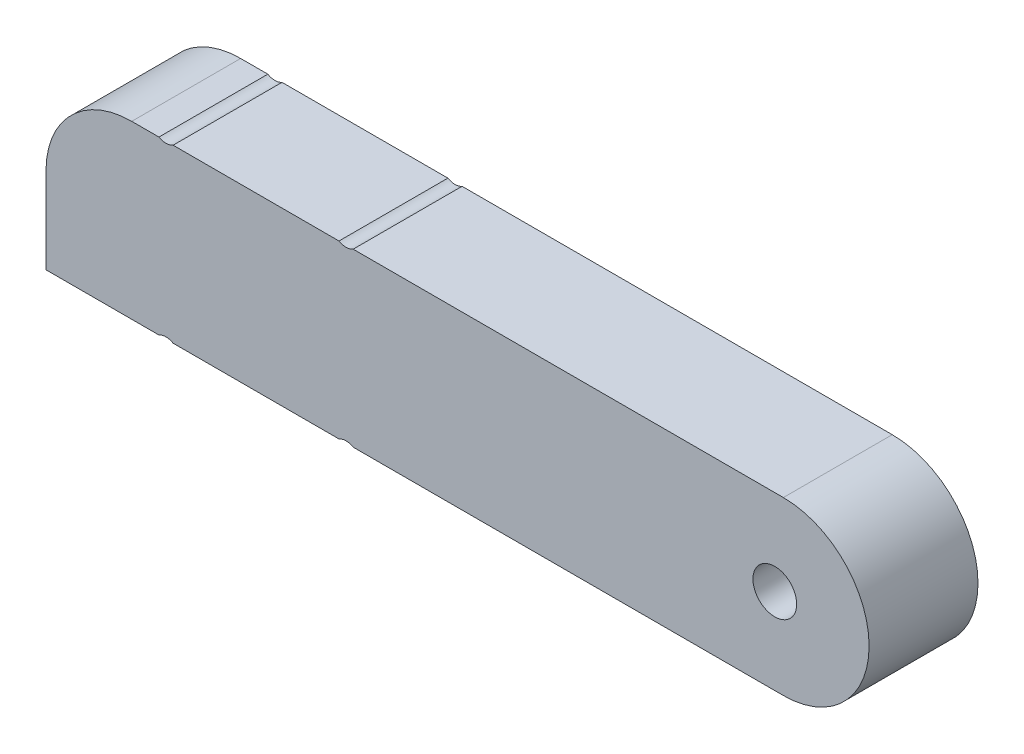
ISO-10303-21;
HEADER;
FILE_DESCRIPTION(('STEP AP214'),'2;1');
FILE_NAME('part.step','',(''),(''),'','','');
FILE_SCHEMA(('AUTOMOTIVE_DESIGN { 1 0 10303 214 1 1 1 1 }'));
ENDSEC;
DATA;
#1=APPLICATION_CONTEXT('core data for automotive mechanical design processes');
#2=APPLICATION_PROTOCOL_DEFINITION('international standard','automotive_design',2000,#1);
#3=PRODUCT_CONTEXT('',#1,'mechanical');
#4=PRODUCT('Part','Part','',(#3));
#5=PRODUCT_RELATED_PRODUCT_CATEGORY('part','',(#4));
#6=PRODUCT_DEFINITION_FORMATION('','',#4);
#7=PRODUCT_DEFINITION_CONTEXT('part definition',#1,'design');
#8=PRODUCT_DEFINITION('design','',#6,#7);
#9=PRODUCT_DEFINITION_SHAPE('','',#8);
#10=(LENGTH_UNIT() NAMED_UNIT(*) SI_UNIT(.MILLI.,.METRE.));
#11=(NAMED_UNIT(*) PLANE_ANGLE_UNIT() SI_UNIT($,.RADIAN.));
#12=(NAMED_UNIT(*) SI_UNIT($,.STERADIAN.) SOLID_ANGLE_UNIT());
#13=UNCERTAINTY_MEASURE_WITH_UNIT(LENGTH_MEASURE(1.E-05),#10,'distance_accuracy_value','');
#14=(GEOMETRIC_REPRESENTATION_CONTEXT(3) GLOBAL_UNCERTAINTY_ASSIGNED_CONTEXT((#13)) GLOBAL_UNIT_ASSIGNED_CONTEXT((#10,
#11,#12)) REPRESENTATION_CONTEXT('',''));
#15=CARTESIAN_POINT('',(0.,0.,0.));
#16=DIRECTION('',(0.,0.,1.));
#17=DIRECTION('',(1.,0.,0.));
#18=AXIS2_PLACEMENT_3D('',#15,#16,#17);
#19=CARTESIAN_POINT('',(69.78921393158,216.609233870136,12.7));
#20=DIRECTION('',(0.,0.,1.));
#21=DIRECTION('',(1.,0.,0.));
#22=AXIS2_PLACEMENT_3D('',#19,#20,#21);
#23=PLANE('',#22);
#24=CARTESIAN_POINT('',(69.78921393158,216.609233870136,12.7));
#25=DIRECTION('',(0.,0.,1.));
#26=DIRECTION('',(1.,0.,0.));
#27=AXIS2_PLACEMENT_3D('',#24,#25,#26);
#28=CIRCLE('',#27,9.99999999996);
#29=CARTESIAN_POINT('',(69.78921393158,226.609233870096,12.7));
#30=VERTEX_POINT('',#29);
#31=CARTESIAN_POINT('',(59.78921393162,216.609233870136,12.7));
#32=VERTEX_POINT('',#31);
#33=EDGE_CURVE('E183',#30,#32,#28,.T.);
#34=ORIENTED_EDGE('',*,*,#33,.T.);
#35=DIRECTION('',(0.,-1.,0.));
#36=VECTOR('',#35,1.);
#37=CARTESIAN_POINT('',(59.78921393162,216.609233870136,12.7));
#38=LINE('',#37,#36);
#39=CARTESIAN_POINT('',(59.78921393162,206.6092338724,12.7));
#40=VERTEX_POINT('',#39);
#41=EDGE_CURVE('E106',#32,#40,#38,.T.);
#42=ORIENTED_EDGE('',*,*,#41,.T.);
#43=DIRECTION('',(1.,0.,0.));
#44=VECTOR('',#43,1.);
#45=CARTESIAN_POINT('',(59.78921393162,206.6092338724,12.7));
#46=LINE('',#45,#44);
#47=CARTESIAN_POINT('',(72.96303274268,206.6092338724,12.7));
#48=VERTEX_POINT('',#47);
#49=EDGE_CURVE('E213',#40,#48,#46,.T.);
#50=ORIENTED_EDGE('',*,*,#49,.T.);
#51=CARTESIAN_POINT('',(73.78921393258,205.20923387332,12.7));
#52=DIRECTION('',(0.,0.,-1.));
#53=DIRECTION('',(1.,0.,0.));
#54=AXIS2_PLACEMENT_3D('',#51,#52,#53);
#55=CIRCLE('',#54,1.62559999875997);
#56=CARTESIAN_POINT('',(74.61539512248,206.6092338724,12.7));
#57=VERTEX_POINT('',#56);
#58=EDGE_CURVE('E232',#48,#57,#55,.T.);
#59=ORIENTED_EDGE('',*,*,#58,.T.);
#60=DIRECTION('',(1.,0.,0.));
#61=VECTOR('',#60,1.);
#62=CARTESIAN_POINT('',(74.61539512248,206.6092338724,12.7));
#63=LINE('',#62,#61);
#64=CARTESIAN_POINT('',(93.96303274158,206.6092338724,12.7));
#65=VERTEX_POINT('',#64);
#66=EDGE_CURVE('E229',#57,#65,#63,.T.);
#67=ORIENTED_EDGE('',*,*,#66,.T.);
#68=CARTESIAN_POINT('',(94.789213931808,205.209233872764,12.7));
#69=DIRECTION('',(0.,0.,-1.));
#70=DIRECTION('',(1.,0.,0.));
#71=AXIS2_PLACEMENT_3D('',#68,#69,#70);
#72=CIRCLE('',#71,1.62559999940544);
#73=CARTESIAN_POINT('',(95.61539512392,206.609233871288,12.7));
#74=VERTEX_POINT('',#73);
#75=EDGE_CURVE('E231',#65,#74,#72,.T.);
#76=ORIENTED_EDGE('',*,*,#75,.T.);
#77=DIRECTION('',(1.,0.,0.));
#78=VECTOR('',#77,1.);
#79=CARTESIAN_POINT('',(95.61539512392,206.609233871288,12.7));
#80=LINE('',#79,#78);
#81=CARTESIAN_POINT('',(145.7892139328,206.609233871288,12.7));
#82=VERTEX_POINT('',#81);
#83=EDGE_CURVE('E234',#74,#82,#80,.T.);
#84=ORIENTED_EDGE('',*,*,#83,.T.);
#85=CARTESIAN_POINT('',(145.7892139328,216.609233871248,12.7));
#86=DIRECTION('',(0.,0.,1.));
#87=DIRECTION('',(1.,0.,0.));
#88=AXIS2_PLACEMENT_3D('',#85,#86,#87);
#89=CIRCLE('',#88,9.99999999996001);
#90=CARTESIAN_POINT('',(145.7892139328,226.609233871208,12.7));
#91=VERTEX_POINT('',#90);
#92=EDGE_CURVE('E240',#82,#91,#89,.T.);
#93=ORIENTED_EDGE('',*,*,#92,.T.);
#94=DIRECTION('',(-1.,0.,0.));
#95=VECTOR('',#94,1.);
#96=CARTESIAN_POINT('',(145.7892139328,226.609233871208,12.7));
#97=LINE('',#96,#95);
#98=CARTESIAN_POINT('',(95.61539512392,226.609233871208,12.7));
#99=VERTEX_POINT('',#98);
#100=EDGE_CURVE('E242',#91,#99,#97,.T.);
#101=ORIENTED_EDGE('',*,*,#100,.T.);
#102=CARTESIAN_POINT('',(94.789213931808,228.009233869732,12.7));
#103=DIRECTION('',(0.,0.,-1.));
#104=DIRECTION('',(1.,0.,0.));
#105=AXIS2_PLACEMENT_3D('',#102,#103,#104);
#106=CIRCLE('',#105,1.62559999940547);
#107=CARTESIAN_POINT('',(93.96303274158,226.609233870096,12.7));
#108=VERTEX_POINT('',#107);
#109=EDGE_CURVE('E140',#99,#108,#106,.T.);
#110=ORIENTED_EDGE('',*,*,#109,.T.);
#111=DIRECTION('',(-1.,0.,0.));
#112=VECTOR('',#111,1.);
#113=CARTESIAN_POINT('',(93.96303274158,226.609233870096,12.7));
#114=LINE('',#113,#112);
#115=CARTESIAN_POINT('',(74.61539512248,226.609233870096,12.7));
#116=VERTEX_POINT('',#115);
#117=EDGE_CURVE('E134',#108,#116,#114,.T.);
#118=ORIENTED_EDGE('',*,*,#117,.T.);
#119=CARTESIAN_POINT('',(73.78921393258,228.009233869176,12.7));
#120=DIRECTION('',(0.,0.,-1.));
#121=DIRECTION('',(1.,0.,0.));
#122=AXIS2_PLACEMENT_3D('',#119,#120,#121);
#123=CIRCLE('',#122,1.62559999876002);
#124=CARTESIAN_POINT('',(72.96303274268,226.609233870096,12.7));
#125=VERTEX_POINT('',#124);
#126=EDGE_CURVE('E138',#116,#125,#123,.T.);
#127=ORIENTED_EDGE('',*,*,#126,.T.);
#128=DIRECTION('',(-1.,0.,0.));
#129=VECTOR('',#128,1.);
#130=CARTESIAN_POINT('',(72.96303274268,226.609233870096,12.7));
#131=LINE('',#130,#129);
#132=EDGE_CURVE('E48',#125,#30,#131,.T.);
#133=ORIENTED_EDGE('',*,*,#132,.T.);
#134=EDGE_LOOP('',(#34,#42,#50,#59,#67,#76,#84,#93,#101,#110,#118,#127,#133));
#135=FACE_BOUND('',#134,.T.);
#136=CARTESIAN_POINT('',(144.78921393382,216.60923387236,12.7));
#137=DIRECTION('',(0.,0.,1.));
#138=DIRECTION('',(1.,0.,0.));
#139=AXIS2_PLACEMENT_3D('',#136,#137,#138);
#140=CIRCLE('',#139,2.55000000031999);
#141=CARTESIAN_POINT('',(147.33921393414,216.60923387236,12.7));
#142=VERTEX_POINT('',#141);
#143=EDGE_CURVE('E162',#142,#142,#140,.T.);
#144=ORIENTED_EDGE('',*,*,#143,.F.);
#145=EDGE_LOOP('',(#144));
#146=FACE_BOUND('',#145,.T.);
#147=ADVANCED_FACE('F31',(#135,#146),#23,.T.);
#148=CARTESIAN_POINT('',(69.78921393158,216.609233870136,0.));
#149=DIRECTION('',(0.,0.,1.));
#150=DIRECTION('',(1.,0.,0.));
#151=AXIS2_PLACEMENT_3D('',#148,#149,#150);
#152=PLANE('',#151);
#153=CARTESIAN_POINT('',(69.78921393158,216.609233870136,0.));
#154=DIRECTION('',(0.,0.,1.));
#155=DIRECTION('',(1.,0.,0.));
#156=AXIS2_PLACEMENT_3D('',#153,#154,#155);
#157=CIRCLE('',#156,9.99999999996);
#158=CARTESIAN_POINT('',(69.78921393158,226.609233870096,0.));
#159=VERTEX_POINT('',#158);
#160=CARTESIAN_POINT('',(59.78921393162,216.609233870136,0.));
#161=VERTEX_POINT('',#160);
#162=EDGE_CURVE('E158',#159,#161,#157,.T.);
#163=ORIENTED_EDGE('',*,*,#162,.F.);
#164=DIRECTION('',(-1.,0.,0.));
#165=VECTOR('',#164,1.);
#166=CARTESIAN_POINT('',(72.96303274268,226.609233870096,0.));
#167=LINE('',#166,#165);
#168=CARTESIAN_POINT('',(72.96303274268,226.609233870096,0.));
#169=VERTEX_POINT('',#168);
#170=EDGE_CURVE('E98',#169,#159,#167,.T.);
#171=ORIENTED_EDGE('',*,*,#170,.F.);
#172=CARTESIAN_POINT('',(73.78921393258,228.009233869176,0.));
#173=DIRECTION('',(0.,0.,-1.));
#174=DIRECTION('',(1.,0.,0.));
#175=AXIS2_PLACEMENT_3D('',#172,#173,#174);
#176=CIRCLE('',#175,1.62559999876002);
#177=CARTESIAN_POINT('',(74.61539512248,226.609233870096,0.));
#178=VERTEX_POINT('',#177);
#179=EDGE_CURVE('E92',#178,#169,#176,.T.);
#180=ORIENTED_EDGE('',*,*,#179,.F.);
#181=DIRECTION('',(-1.,0.,0.));
#182=VECTOR('',#181,1.);
#183=CARTESIAN_POINT('',(93.96303274158,226.609233870096,0.));
#184=LINE('',#183,#182);
#185=CARTESIAN_POINT('',(93.96303274158,226.609233870096,0.));
#186=VERTEX_POINT('',#185);
#187=EDGE_CURVE('E148',#186,#178,#184,.T.);
#188=ORIENTED_EDGE('',*,*,#187,.F.);
#189=CARTESIAN_POINT('',(94.789213931808,228.009233869732,0.));
#190=DIRECTION('',(0.,0.,-1.));
#191=DIRECTION('',(1.,0.,0.));
#192=AXIS2_PLACEMENT_3D('',#189,#190,#191);
#193=CIRCLE('',#192,1.62559999940547);
#194=CARTESIAN_POINT('',(95.61539512392,226.609233871208,0.));
#195=VERTEX_POINT('',#194);
#196=EDGE_CURVE('E178',#195,#186,#193,.T.);
#197=ORIENTED_EDGE('',*,*,#196,.F.);
#198=DIRECTION('',(-1.,0.,0.));
#199=VECTOR('',#198,1.);
#200=CARTESIAN_POINT('',(145.7892139328,226.609233871208,0.));
#201=LINE('',#200,#199);
#202=CARTESIAN_POINT('',(145.7892139328,226.609233871208,0.));
#203=VERTEX_POINT('',#202);
#204=EDGE_CURVE('E176',#203,#195,#201,.T.);
#205=ORIENTED_EDGE('',*,*,#204,.F.);
#206=CARTESIAN_POINT('',(145.7892139328,216.609233871248,0.));
#207=DIRECTION('',(0.,0.,1.));
#208=DIRECTION('',(1.,0.,0.));
#209=AXIS2_PLACEMENT_3D('',#206,#207,#208);
#210=CIRCLE('',#209,9.99999999996001);
#211=CARTESIAN_POINT('',(145.7892139328,206.609233871288,0.));
#212=VERTEX_POINT('',#211);
#213=EDGE_CURVE('E174',#212,#203,#210,.T.);
#214=ORIENTED_EDGE('',*,*,#213,.F.);
#215=DIRECTION('',(1.,0.,0.));
#216=VECTOR('',#215,1.);
#217=CARTESIAN_POINT('',(95.61539512392,206.609233871288,0.));
#218=LINE('',#217,#216);
#219=CARTESIAN_POINT('',(95.61539512392,206.609233871288,0.));
#220=VERTEX_POINT('',#219);
#221=EDGE_CURVE('E172',#220,#212,#218,.T.);
#222=ORIENTED_EDGE('',*,*,#221,.F.);
#223=CARTESIAN_POINT('',(94.789213931808,205.209233872764,0.));
#224=DIRECTION('',(0.,0.,-1.));
#225=DIRECTION('',(1.,0.,0.));
#226=AXIS2_PLACEMENT_3D('',#223,#224,#225);
#227=CIRCLE('',#226,1.62559999940544);
#228=CARTESIAN_POINT('',(93.96303274158,206.6092338724,0.));
#229=VERTEX_POINT('',#228);
#230=EDGE_CURVE('E170',#229,#220,#227,.T.);
#231=ORIENTED_EDGE('',*,*,#230,.F.);
#232=DIRECTION('',(1.,0.,0.));
#233=VECTOR('',#232,1.);
#234=CARTESIAN_POINT('',(74.61539512248,206.6092338724,0.));
#235=LINE('',#234,#233);
#236=CARTESIAN_POINT('',(74.61539512248,206.6092338724,0.));
#237=VERTEX_POINT('',#236);
#238=EDGE_CURVE('E168',#237,#229,#235,.T.);
#239=ORIENTED_EDGE('',*,*,#238,.F.);
#240=CARTESIAN_POINT('',(73.78921393258,205.20923387332,0.));
#241=DIRECTION('',(0.,0.,-1.));
#242=DIRECTION('',(1.,0.,0.));
#243=AXIS2_PLACEMENT_3D('',#240,#241,#242);
#244=CIRCLE('',#243,1.62559999875997);
#245=CARTESIAN_POINT('',(72.96303274268,206.6092338724,0.));
#246=VERTEX_POINT('',#245);
#247=EDGE_CURVE('E166',#246,#237,#244,.T.);
#248=ORIENTED_EDGE('',*,*,#247,.F.);
#249=DIRECTION('',(1.,0.,0.));
#250=VECTOR('',#249,1.);
#251=CARTESIAN_POINT('',(59.78921393162,206.6092338724,0.));
#252=LINE('',#251,#250);
#253=CARTESIAN_POINT('',(59.78921393162,206.6092338724,0.));
#254=VERTEX_POINT('',#253);
#255=EDGE_CURVE('E164',#254,#246,#252,.T.);
#256=ORIENTED_EDGE('',*,*,#255,.F.);
#257=DIRECTION('',(0.,-1.,0.));
#258=VECTOR('',#257,1.);
#259=CARTESIAN_POINT('',(59.78921393162,216.609233870136,0.));
#260=LINE('',#259,#258);
#261=EDGE_CURVE('E161',#161,#254,#260,.T.);
#262=ORIENTED_EDGE('',*,*,#261,.F.);
#263=EDGE_LOOP('',(#163,#171,#180,#188,#197,#205,#214,#222,#231,#239,#248,#256,#262));
#264=FACE_BOUND('',#263,.T.);
#265=CARTESIAN_POINT('',(144.78921393382,216.60923387236,0.));
#266=DIRECTION('',(0.,0.,1.));
#267=DIRECTION('',(1.,0.,0.));
#268=AXIS2_PLACEMENT_3D('',#265,#266,#267);
#269=CIRCLE('',#268,2.55000000031999);
#270=CARTESIAN_POINT('',(147.33921393414,216.60923387236,0.));
#271=VERTEX_POINT('',#270);
#272=EDGE_CURVE('E402',#271,#271,#269,.T.);
#273=ORIENTED_EDGE('',*,*,#272,.T.);
#274=EDGE_LOOP('',(#273));
#275=FACE_BOUND('',#274,.T.);
#276=ADVANCED_FACE('F217',(#264,#275),#152,.F.);
#277=CARTESIAN_POINT('',(69.78921393158,216.609233870136,12.7));
#278=DIRECTION('',(0.,0.,-1.));
#279=DIRECTION('',(-1.,0.,0.));
#280=AXIS2_PLACEMENT_3D('',#277,#278,#279);
#281=CYLINDRICAL_SURFACE('',#280,9.99999999996);
#282=ORIENTED_EDGE('',*,*,#162,.T.);
#283=DIRECTION('',(0.,0.,-1.));
#284=VECTOR('',#283,1.);
#285=CARTESIAN_POINT('',(59.78921393162,216.609233870136,12.7));
#286=LINE('',#285,#284);
#287=EDGE_CURVE('E11',#32,#161,#286,.T.);
#288=ORIENTED_EDGE('',*,*,#287,.F.);
#289=ORIENTED_EDGE('',*,*,#33,.F.);
#290=DIRECTION('',(0.,0.,-1.));
#291=VECTOR('',#290,1.);
#292=CARTESIAN_POINT('',(69.78921393158,226.609233870096,12.7));
#293=LINE('',#292,#291);
#294=EDGE_CURVE('E154',#30,#159,#293,.T.);
#295=ORIENTED_EDGE('',*,*,#294,.T.);
#296=EDGE_LOOP('',(#282,#288,#289,#295));
#297=FACE_BOUND('',#296,.T.);
#298=ADVANCED_FACE('F33',(#297),#281,.T.);
#299=CARTESIAN_POINT('',(59.78921393162,216.609233870136,12.7));
#300=DIRECTION('',(1.,0.,0.));
#301=DIRECTION('',(0.,1.,0.));
#302=AXIS2_PLACEMENT_3D('',#299,#300,#301);
#303=PLANE('',#302);
#304=ORIENTED_EDGE('',*,*,#261,.T.);
#305=DIRECTION('',(0.,0.,-1.));
#306=VECTOR('',#305,1.);
#307=CARTESIAN_POINT('',(59.78921393162,206.6092338724,12.7));
#308=LINE('',#307,#306);
#309=EDGE_CURVE('E40',#40,#254,#308,.T.);
#310=ORIENTED_EDGE('',*,*,#309,.F.);
#311=ORIENTED_EDGE('',*,*,#41,.F.);
#312=ORIENTED_EDGE('',*,*,#287,.T.);
#313=EDGE_LOOP('',(#304,#310,#311,#312));
#314=FACE_BOUND('',#313,.T.);
#315=ADVANCED_FACE('F276',(#314),#303,.F.);
#316=CARTESIAN_POINT('',(59.78921393162,206.6092338724,12.7));
#317=DIRECTION('',(0.,1.,0.));
#318=DIRECTION('',(0.,0.,1.));
#319=AXIS2_PLACEMENT_3D('',#316,#317,#318);
#320=PLANE('',#319);
#321=ORIENTED_EDGE('',*,*,#255,.T.);
#322=DIRECTION('',(0.,0.,-1.));
#323=VECTOR('',#322,1.);
#324=CARTESIAN_POINT('',(72.96303274268,206.6092338724,12.7));
#325=LINE('',#324,#323);
#326=EDGE_CURVE('E205',#48,#246,#325,.T.);
#327=ORIENTED_EDGE('',*,*,#326,.F.);
#328=ORIENTED_EDGE('',*,*,#49,.F.);
#329=ORIENTED_EDGE('',*,*,#309,.T.);
#330=EDGE_LOOP('',(#321,#327,#328,#329));
#331=FACE_BOUND('',#330,.T.);
#332=ADVANCED_FACE('F211',(#331),#320,.F.);
#333=CARTESIAN_POINT('',(73.78921393258,205.20923387332,12.7));
#334=DIRECTION('',(0.,0.,-1.));
#335=DIRECTION('',(-1.,0.,0.));
#336=AXIS2_PLACEMENT_3D('',#333,#334,#335);
#337=CYLINDRICAL_SURFACE('',#336,1.62559999875997);
#338=ORIENTED_EDGE('',*,*,#247,.T.);
#339=DIRECTION('',(0.,0.,-1.));
#340=VECTOR('',#339,1.);
#341=CARTESIAN_POINT('',(74.61539512248,206.6092338724,12.7));
#342=LINE('',#341,#340);
#343=EDGE_CURVE('E202',#57,#237,#342,.T.);
#344=ORIENTED_EDGE('',*,*,#343,.F.);
#345=ORIENTED_EDGE('',*,*,#58,.F.);
#346=ORIENTED_EDGE('',*,*,#326,.T.);
#347=EDGE_LOOP('',(#338,#344,#345,#346));
#348=FACE_BOUND('',#347,.T.);
#349=ADVANCED_FACE('F223',(#348),#337,.F.);
#350=CARTESIAN_POINT('',(74.61539512248,206.6092338724,12.7));
#351=DIRECTION('',(0.,1.,0.));
#352=DIRECTION('',(0.,0.,1.));
#353=AXIS2_PLACEMENT_3D('',#350,#351,#352);
#354=PLANE('',#353);
#355=ORIENTED_EDGE('',*,*,#238,.T.);
#356=DIRECTION('',(0.,0.,-1.));
#357=VECTOR('',#356,1.);
#358=CARTESIAN_POINT('',(93.96303274158,206.6092338724,12.7));
#359=LINE('',#358,#357);
#360=EDGE_CURVE('E199',#65,#229,#359,.T.);
#361=ORIENTED_EDGE('',*,*,#360,.F.);
#362=ORIENTED_EDGE('',*,*,#66,.F.);
#363=ORIENTED_EDGE('',*,*,#343,.T.);
#364=EDGE_LOOP('',(#355,#361,#362,#363));
#365=FACE_BOUND('',#364,.T.);
#366=ADVANCED_FACE('F227',(#365),#354,.F.);
#367=CARTESIAN_POINT('',(94.789213931808,205.209233872764,12.7));
#368=DIRECTION('',(0.,0.,-1.));
#369=DIRECTION('',(-1.,0.,0.));
#370=AXIS2_PLACEMENT_3D('',#367,#368,#369);
#371=CYLINDRICAL_SURFACE('',#370,1.62559999940544);
#372=ORIENTED_EDGE('',*,*,#230,.T.);
#373=DIRECTION('',(0.,0.,-1.));
#374=VECTOR('',#373,1.);
#375=CARTESIAN_POINT('',(95.61539512392,206.609233871288,12.7));
#376=LINE('',#375,#374);
#377=EDGE_CURVE('E196',#74,#220,#376,.T.);
#378=ORIENTED_EDGE('',*,*,#377,.F.);
#379=ORIENTED_EDGE('',*,*,#75,.F.);
#380=ORIENTED_EDGE('',*,*,#360,.T.);
#381=EDGE_LOOP('',(#372,#378,#379,#380));
#382=FACE_BOUND('',#381,.T.);
#383=ADVANCED_FACE('F289',(#382),#371,.F.);
#384=CARTESIAN_POINT('',(95.61539512392,206.609233871288,12.7));
#385=DIRECTION('',(0.,1.,0.));
#386=DIRECTION('',(0.,0.,1.));
#387=AXIS2_PLACEMENT_3D('',#384,#385,#386);
#388=PLANE('',#387);
#389=ORIENTED_EDGE('',*,*,#221,.T.);
#390=DIRECTION('',(0.,0.,-1.));
#391=VECTOR('',#390,1.);
#392=CARTESIAN_POINT('',(145.7892139328,206.609233871288,12.7));
#393=LINE('',#392,#391);
#394=EDGE_CURVE('E193',#82,#212,#393,.T.);
#395=ORIENTED_EDGE('',*,*,#394,.F.);
#396=ORIENTED_EDGE('',*,*,#83,.F.);
#397=ORIENTED_EDGE('',*,*,#377,.T.);
#398=EDGE_LOOP('',(#389,#395,#396,#397));
#399=FACE_BOUND('',#398,.T.);
#400=ADVANCED_FACE('F292',(#399),#388,.F.);
#401=CARTESIAN_POINT('',(145.7892139328,216.609233871248,12.7));
#402=DIRECTION('',(0.,0.,-1.));
#403=DIRECTION('',(-1.,0.,0.));
#404=AXIS2_PLACEMENT_3D('',#401,#402,#403);
#405=CYLINDRICAL_SURFACE('',#404,9.99999999996001);
#406=ORIENTED_EDGE('',*,*,#213,.T.);
#407=DIRECTION('',(0.,0.,-1.));
#408=VECTOR('',#407,1.);
#409=CARTESIAN_POINT('',(145.7892139328,226.609233871208,12.7));
#410=LINE('',#409,#408);
#411=EDGE_CURVE('E190',#91,#203,#410,.T.);
#412=ORIENTED_EDGE('',*,*,#411,.F.);
#413=ORIENTED_EDGE('',*,*,#92,.F.);
#414=ORIENTED_EDGE('',*,*,#394,.T.);
#415=EDGE_LOOP('',(#406,#412,#413,#414));
#416=FACE_BOUND('',#415,.T.);
#417=ADVANCED_FACE('F296',(#416),#405,.T.);
#418=CARTESIAN_POINT('',(145.7892139328,226.609233871208,12.7));
#419=DIRECTION('',(0.,-1.,0.));
#420=DIRECTION('',(0.,0.,-1.));
#421=AXIS2_PLACEMENT_3D('',#418,#419,#420);
#422=PLANE('',#421);
#423=ORIENTED_EDGE('',*,*,#204,.T.);
#424=DIRECTION('',(0.,0.,-1.));
#425=VECTOR('',#424,1.);
#426=CARTESIAN_POINT('',(95.61539512392,226.609233871208,12.7));
#427=LINE('',#426,#425);
#428=EDGE_CURVE('E187',#99,#195,#427,.T.);
#429=ORIENTED_EDGE('',*,*,#428,.F.);
#430=ORIENTED_EDGE('',*,*,#100,.F.);
#431=ORIENTED_EDGE('',*,*,#411,.T.);
#432=EDGE_LOOP('',(#423,#429,#430,#431));
#433=FACE_BOUND('',#432,.T.);
#434=ADVANCED_FACE('F248',(#433),#422,.F.);
#435=CARTESIAN_POINT('',(94.789213931808,228.009233869732,12.7));
#436=DIRECTION('',(0.,0.,-1.));
#437=DIRECTION('',(-1.,0.,0.));
#438=AXIS2_PLACEMENT_3D('',#435,#436,#437);
#439=CYLINDRICAL_SURFACE('',#438,1.62559999940547);
#440=ORIENTED_EDGE('',*,*,#196,.T.);
#441=DIRECTION('',(0.,0.,-1.));
#442=VECTOR('',#441,1.);
#443=CARTESIAN_POINT('',(93.96303274158,226.609233870096,12.7));
#444=LINE('',#443,#442);
#445=EDGE_CURVE('E149',#108,#186,#444,.T.);
#446=ORIENTED_EDGE('',*,*,#445,.F.);
#447=ORIENTED_EDGE('',*,*,#109,.F.);
#448=ORIENTED_EDGE('',*,*,#428,.T.);
#449=EDGE_LOOP('',(#440,#446,#447,#448));
#450=FACE_BOUND('',#449,.T.);
#451=ADVANCED_FACE('F252',(#450),#439,.F.);
#452=CARTESIAN_POINT('',(93.96303274158,226.609233870096,12.7));
#453=DIRECTION('',(0.,-1.,0.));
#454=DIRECTION('',(0.,0.,-1.));
#455=AXIS2_PLACEMENT_3D('',#452,#453,#454);
#456=PLANE('',#455);
#457=ORIENTED_EDGE('',*,*,#187,.T.);
#458=DIRECTION('',(0.,0.,-1.));
#459=VECTOR('',#458,1.);
#460=CARTESIAN_POINT('',(74.61539512248,226.609233870096,12.7));
#461=LINE('',#460,#459);
#462=EDGE_CURVE('E145',#116,#178,#461,.T.);
#463=ORIENTED_EDGE('',*,*,#462,.F.);
#464=ORIENTED_EDGE('',*,*,#117,.F.);
#465=ORIENTED_EDGE('',*,*,#445,.T.);
#466=EDGE_LOOP('',(#457,#463,#464,#465));
#467=FACE_BOUND('',#466,.T.);
#468=ADVANCED_FACE('F146',(#467),#456,.F.);
#469=CARTESIAN_POINT('',(73.78921393258,228.009233869176,12.7));
#470=DIRECTION('',(0.,0.,-1.));
#471=DIRECTION('',(-1.,0.,0.));
#472=AXIS2_PLACEMENT_3D('',#469,#470,#471);
#473=CYLINDRICAL_SURFACE('',#472,1.62559999876002);
#474=ORIENTED_EDGE('',*,*,#179,.T.);
#475=DIRECTION('',(0.,0.,-1.));
#476=VECTOR('',#475,1.);
#477=CARTESIAN_POINT('',(72.96303274268,226.609233870096,12.7));
#478=LINE('',#477,#476);
#479=EDGE_CURVE('E150',#125,#169,#478,.T.);
#480=ORIENTED_EDGE('',*,*,#479,.F.);
#481=ORIENTED_EDGE('',*,*,#126,.F.);
#482=ORIENTED_EDGE('',*,*,#462,.T.);
#483=EDGE_LOOP('',(#474,#480,#481,#482));
#484=FACE_BOUND('',#483,.T.);
#485=ADVANCED_FACE('F152',(#484),#473,.F.);
#486=CARTESIAN_POINT('',(72.96303274268,226.609233870096,12.7));
#487=DIRECTION('',(0.,-1.,0.));
#488=DIRECTION('',(0.,0.,-1.));
#489=AXIS2_PLACEMENT_3D('',#486,#487,#488);
#490=PLANE('',#489);
#491=ORIENTED_EDGE('',*,*,#170,.T.);
#492=ORIENTED_EDGE('',*,*,#294,.F.);
#493=ORIENTED_EDGE('',*,*,#132,.F.);
#494=ORIENTED_EDGE('',*,*,#479,.T.);
#495=EDGE_LOOP('',(#491,#492,#493,#494));
#496=FACE_BOUND('',#495,.T.);
#497=ADVANCED_FACE('F256',(#496),#490,.F.);
#498=CARTESIAN_POINT('',(144.78921393382,216.60923387236,12.7));
#499=DIRECTION('',(0.,0.,-1.));
#500=DIRECTION('',(-1.,0.,0.));
#501=AXIS2_PLACEMENT_3D('',#498,#499,#500);
#502=CYLINDRICAL_SURFACE('',#501,2.55000000031999);
#503=ORIENTED_EDGE('',*,*,#143,.T.);
#504=EDGE_LOOP('',(#503));
#505=FACE_BOUND('',#504,.T.);
#506=ORIENTED_EDGE('',*,*,#272,.F.);
#507=EDGE_LOOP('',(#506));
#508=FACE_BOUND('',#507,.T.);
#509=ADVANCED_FACE('F258',(#505,#508),#502,.F.);
#510=CLOSED_SHELL('',(#147,#276,#298,#315,#332,#349,#366,#383,#400,#417,#434,#451,#468,#485,
#497,#509));
#511=MANIFOLD_SOLID_BREP('B2',#510);
#512=ADVANCED_BREP_SHAPE_REPRESENTATION('',(#18,#511),#14);
#513=SHAPE_DEFINITION_REPRESENTATION(#9,#512);
ENDSEC;
END-ISO-10303-21;
